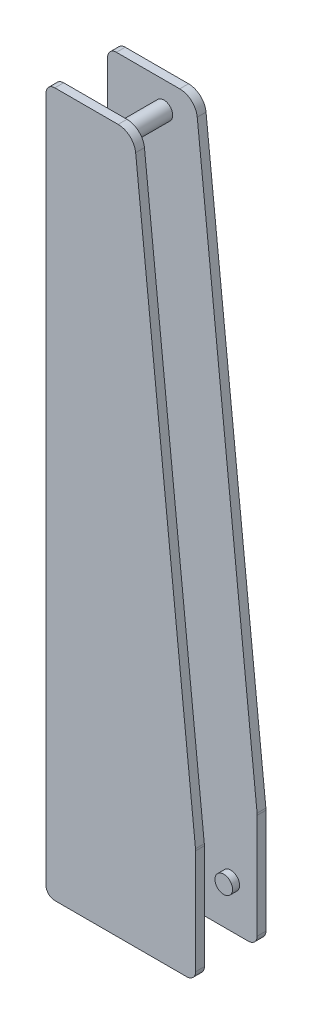
ISO-10303-21;
HEADER;
FILE_DESCRIPTION(('STEP AP214'),'2;1');
FILE_NAME('part.step','',(''),(''),'','','');
FILE_SCHEMA(('AUTOMOTIVE_DESIGN { 1 0 10303 214 1 1 1 1 }'));
ENDSEC;
DATA;
#1=APPLICATION_CONTEXT('core data for automotive mechanical design processes');
#2=APPLICATION_PROTOCOL_DEFINITION('international standard','automotive_design',2000,#1);
#3=PRODUCT_CONTEXT('',#1,'mechanical');
#4=PRODUCT('Part','Part','',(#3));
#5=PRODUCT_RELATED_PRODUCT_CATEGORY('part','',(#4));
#6=PRODUCT_DEFINITION_FORMATION('','',#4);
#7=PRODUCT_DEFINITION_CONTEXT('part definition',#1,'design');
#8=PRODUCT_DEFINITION('design','',#6,#7);
#9=PRODUCT_DEFINITION_SHAPE('','',#8);
#10=(LENGTH_UNIT() NAMED_UNIT(*) SI_UNIT(.MILLI.,.METRE.));
#11=(NAMED_UNIT(*) PLANE_ANGLE_UNIT() SI_UNIT($,.RADIAN.));
#12=(NAMED_UNIT(*) SI_UNIT($,.STERADIAN.) SOLID_ANGLE_UNIT());
#13=UNCERTAINTY_MEASURE_WITH_UNIT(LENGTH_MEASURE(1.E-05),#10,'distance_accuracy_value','');
#14=(GEOMETRIC_REPRESENTATION_CONTEXT(3) GLOBAL_UNCERTAINTY_ASSIGNED_CONTEXT((#13)) GLOBAL_UNIT_ASSIGNED_CONTEXT((#10,
#11,#12)) REPRESENTATION_CONTEXT('',''));
#15=CARTESIAN_POINT('',(0.,0.,0.));
#16=DIRECTION('',(0.,0.,1.));
#17=DIRECTION('',(1.,0.,0.));
#18=AXIS2_PLACEMENT_3D('',#15,#16,#17);
#19=CARTESIAN_POINT('',(20.,-75.,35.));
#20=DIRECTION('',(0.,0.,-1.));
#21=DIRECTION('',(-1.,0.,0.));
#22=AXIS2_PLACEMENT_3D('',#19,#20,#21);
#23=CYLINDRICAL_SURFACE('',#22,5.);
#24=CARTESIAN_POINT('',(20.,-75.,5.));
#25=DIRECTION('',(0.,0.,-1.));
#26=DIRECTION('',(-1.,0.,0.));
#27=AXIS2_PLACEMENT_3D('',#24,#25,#26);
#28=CIRCLE('',#27,5.);
#29=CARTESIAN_POINT('',(15.,-75.,5.));
#30=VERTEX_POINT('',#29);
#31=EDGE_CURVE('E11',#30,#30,#28,.F.);
#32=ORIENTED_EDGE('',*,*,#31,.T.);
#33=EDGE_LOOP('',(#32));
#34=FACE_BOUND('',#33,.T.);
#35=CARTESIAN_POINT('',(20.,-75.,9.));
#36=DIRECTION('',(0.,0.,1.));
#37=DIRECTION('',(1.,0.,0.));
#38=AXIS2_PLACEMENT_3D('',#35,#36,#37);
#39=CIRCLE('',#38,5.);
#40=CARTESIAN_POINT('',(25.,-75.,9.));
#41=VERTEX_POINT('',#40);
#42=EDGE_CURVE('E519',#41,#41,#39,.T.);
#43=ORIENTED_EDGE('',*,*,#42,.F.);
#44=EDGE_LOOP('',(#43));
#45=FACE_BOUND('',#44,.T.);
#46=ADVANCED_FACE('F45',(#34,#45),#23,.T.);
#47=CARTESIAN_POINT('',(25.,-35.5209702462818,5.));
#48=DIRECTION('',(0.,0.,-1.));
#49=DIRECTION('',(-1.,0.,0.));
#50=AXIS2_PLACEMENT_3D('',#47,#48,#49);
#51=CYLINDRICAL_SURFACE('',#50,10.);
#52=CARTESIAN_POINT('',(25.,-35.5209702462818,0.));
#53=DIRECTION('',(0.,0.,1.));
#54=DIRECTION('',(-1.,0.,0.));
#55=AXIS2_PLACEMENT_3D('',#52,#53,#54);
#56=CIRCLE('',#55,10.);
#57=CARTESIAN_POINT('',(35.,-35.5209702462818,0.));
#58=VERTEX_POINT('',#57);
#59=CARTESIAN_POINT('',(34.9458649284941,-34.481850029872,0.));
#60=VERTEX_POINT('',#59);
#61=EDGE_CURVE('E159',#58,#60,#56,.T.);
#62=ORIENTED_EDGE('',*,*,#61,.T.);
#63=DIRECTION('',(0.,0.,-1.));
#64=VECTOR('',#63,1.);
#65=CARTESIAN_POINT('',(34.9458649284941,-34.481850029872,5.));
#66=LINE('',#65,#64);
#67=CARTESIAN_POINT('',(34.9458649284941,-34.481850029872,5.));
#68=VERTEX_POINT('',#67);
#69=EDGE_CURVE('E197',#68,#60,#66,.T.);
#70=ORIENTED_EDGE('',*,*,#69,.F.);
#71=CARTESIAN_POINT('',(25.,-35.5209702462818,5.));
#72=DIRECTION('',(0.,0.,1.));
#73=DIRECTION('',(-1.,0.,0.));
#74=AXIS2_PLACEMENT_3D('',#71,#72,#73);
#75=CIRCLE('',#74,10.);
#76=CARTESIAN_POINT('',(35.,-35.5209702462818,5.));
#77=VERTEX_POINT('',#76);
#78=EDGE_CURVE('E178',#77,#68,#75,.T.);
#79=ORIENTED_EDGE('',*,*,#78,.F.);
#80=DIRECTION('',(0.,0.,-1.));
#81=VECTOR('',#80,1.);
#82=CARTESIAN_POINT('',(35.,-35.5209702462818,5.));
#83=LINE('',#82,#81);
#84=EDGE_CURVE('E155',#77,#58,#83,.T.);
#85=ORIENTED_EDGE('',*,*,#84,.T.);
#86=EDGE_LOOP('',(#62,#70,#79,#85));
#87=FACE_BOUND('',#86,.T.);
#88=ADVANCED_FACE('F47',(#87),#51,.T.);
#89=CARTESIAN_POINT('',(0.936211320673575,291.03912021641,5.));
#90=DIRECTION('',(-0.994586492849407,-0.103912021640983,0.));
#91=DIRECTION('',(0.103912021640983,-0.994586492849407,0.));
#92=AXIS2_PLACEMENT_3D('',#89,#90,#91);
#93=PLANE('',#92);
#94=DIRECTION('',(-0.103912021640983,0.994586492849407,0.));
#95=VECTOR('',#94,1.);
#96=CARTESIAN_POINT('',(0.936211320673575,291.03912021641,0.));
#97=LINE('',#96,#95);
#98=CARTESIAN_POINT('',(0.936211320673575,291.03912021641,0.));
#99=VERTEX_POINT('',#98);
#100=EDGE_CURVE('E162',#60,#99,#97,.T.);
#101=ORIENTED_EDGE('',*,*,#100,.T.);
#102=DIRECTION('',(0.,0.,-1.));
#103=VECTOR('',#102,1.);
#104=CARTESIAN_POINT('',(0.936211320673575,291.03912021641,5.));
#105=LINE('',#104,#103);
#106=CARTESIAN_POINT('',(0.936211320673575,291.03912021641,5.));
#107=VERTEX_POINT('',#106);
#108=EDGE_CURVE('E194',#107,#99,#105,.T.);
#109=ORIENTED_EDGE('',*,*,#108,.F.);
#110=DIRECTION('',(-0.103912021640983,0.994586492849407,0.));
#111=VECTOR('',#110,1.);
#112=CARTESIAN_POINT('',(0.936211320673575,291.03912021641,5.));
#113=LINE('',#112,#111);
#114=EDGE_CURVE('E113',#68,#107,#113,.T.);
#115=ORIENTED_EDGE('',*,*,#114,.F.);
#116=ORIENTED_EDGE('',*,*,#69,.T.);
#117=EDGE_LOOP('',(#101,#109,#115,#116));
#118=FACE_BOUND('',#117,.T.);
#119=ADVANCED_FACE('F227',(#118),#93,.F.);
#120=CARTESIAN_POINT('',(-9.0096536078205,290.,5.));
#121=DIRECTION('',(0.,0.,-1.));
#122=DIRECTION('',(-1.,0.,0.));
#123=AXIS2_PLACEMENT_3D('',#120,#121,#122);
#124=CYLINDRICAL_SURFACE('',#123,10.);
#125=CARTESIAN_POINT('',(-9.0096536078205,290.,0.));
#126=DIRECTION('',(0.,0.,1.));
#127=DIRECTION('',(1.,0.,0.));
#128=AXIS2_PLACEMENT_3D('',#125,#126,#127);
#129=CIRCLE('',#128,10.);
#130=CARTESIAN_POINT('',(-9.0096536078205,300.,0.));
#131=VERTEX_POINT('',#130);
#132=EDGE_CURVE('E165',#99,#131,#129,.T.);
#133=ORIENTED_EDGE('',*,*,#132,.T.);
#134=DIRECTION('',(0.,0.,-1.));
#135=VECTOR('',#134,1.);
#136=CARTESIAN_POINT('',(-9.0096536078205,300.,5.));
#137=LINE('',#136,#135);
#138=CARTESIAN_POINT('',(-9.0096536078205,300.,5.));
#139=VERTEX_POINT('',#138);
#140=EDGE_CURVE('E191',#139,#131,#137,.T.);
#141=ORIENTED_EDGE('',*,*,#140,.F.);
#142=CARTESIAN_POINT('',(-9.0096536078205,290.,5.));
#143=DIRECTION('',(0.,0.,1.));
#144=DIRECTION('',(1.,0.,0.));
#145=AXIS2_PLACEMENT_3D('',#142,#143,#144);
#146=CIRCLE('',#145,10.);
#147=EDGE_CURVE('E259',#107,#139,#146,.T.);
#148=ORIENTED_EDGE('',*,*,#147,.F.);
#149=ORIENTED_EDGE('',*,*,#108,.T.);
#150=EDGE_LOOP('',(#133,#141,#148,#149));
#151=FACE_BOUND('',#150,.T.);
#152=ADVANCED_FACE('F283',(#151),#124,.T.);
#153=CARTESIAN_POINT('',(-45.,300.,5.));
#154=DIRECTION('',(0.,-1.,0.));
#155=DIRECTION('',(0.,0.,-1.));
#156=AXIS2_PLACEMENT_3D('',#153,#154,#155);
#157=PLANE('',#156);
#158=DIRECTION('',(-1.,0.,0.));
#159=VECTOR('',#158,1.);
#160=CARTESIAN_POINT('',(-45.,300.,0.));
#161=LINE('',#160,#159);
#162=CARTESIAN_POINT('',(-45.,300.,0.));
#163=VERTEX_POINT('',#162);
#164=EDGE_CURVE('E167',#131,#163,#161,.T.);
#165=ORIENTED_EDGE('',*,*,#164,.T.);
#166=DIRECTION('',(0.,0.,-1.));
#167=VECTOR('',#166,1.);
#168=CARTESIAN_POINT('',(-45.,300.,5.));
#169=LINE('',#168,#167);
#170=CARTESIAN_POINT('',(-45.,300.,5.));
#171=VERTEX_POINT('',#170);
#172=EDGE_CURVE('E188',#171,#163,#169,.T.);
#173=ORIENTED_EDGE('',*,*,#172,.F.);
#174=DIRECTION('',(-1.,0.,0.));
#175=VECTOR('',#174,1.);
#176=CARTESIAN_POINT('',(-45.,300.,5.));
#177=LINE('',#176,#175);
#178=EDGE_CURVE('E261',#139,#171,#177,.T.);
#179=ORIENTED_EDGE('',*,*,#178,.F.);
#180=ORIENTED_EDGE('',*,*,#140,.T.);
#181=EDGE_LOOP('',(#165,#173,#179,#180));
#182=FACE_BOUND('',#181,.T.);
#183=ADVANCED_FACE('F288',(#182),#157,.F.);
#184=CARTESIAN_POINT('',(-45.,295.,5.));
#185=DIRECTION('',(0.,0.,-1.));
#186=DIRECTION('',(-1.,0.,0.));
#187=AXIS2_PLACEMENT_3D('',#184,#185,#186);
#188=CYLINDRICAL_SURFACE('',#187,5.00000000000001);
#189=CARTESIAN_POINT('',(-45.,295.,0.));
#190=DIRECTION('',(0.,0.,1.));
#191=DIRECTION('',(1.,0.,0.));
#192=AXIS2_PLACEMENT_3D('',#189,#190,#191);
#193=CIRCLE('',#192,5.00000000000001);
#194=CARTESIAN_POINT('',(-50.,295.,0.));
#195=VERTEX_POINT('',#194);
#196=EDGE_CURVE('E169',#163,#195,#193,.T.);
#197=ORIENTED_EDGE('',*,*,#196,.T.);
#198=DIRECTION('',(0.,0.,-1.));
#199=VECTOR('',#198,1.);
#200=CARTESIAN_POINT('',(-50.,295.,5.));
#201=LINE('',#200,#199);
#202=CARTESIAN_POINT('',(-50.,295.,5.));
#203=VERTEX_POINT('',#202);
#204=EDGE_CURVE('E185',#203,#195,#201,.T.);
#205=ORIENTED_EDGE('',*,*,#204,.F.);
#206=CARTESIAN_POINT('',(-45.,295.,5.));
#207=DIRECTION('',(0.,0.,1.));
#208=DIRECTION('',(1.,0.,0.));
#209=AXIS2_PLACEMENT_3D('',#206,#207,#208);
#210=CIRCLE('',#209,5.00000000000001);
#211=EDGE_CURVE('E263',#171,#203,#210,.T.);
#212=ORIENTED_EDGE('',*,*,#211,.F.);
#213=ORIENTED_EDGE('',*,*,#172,.T.);
#214=EDGE_LOOP('',(#197,#205,#212,#213));
#215=FACE_BOUND('',#214,.T.);
#216=ADVANCED_FACE('F291',(#215),#188,.T.);
#217=CARTESIAN_POINT('',(-50.,295.,5.));
#218=DIRECTION('',(1.,0.,0.));
#219=DIRECTION('',(0.,1.,0.));
#220=AXIS2_PLACEMENT_3D('',#217,#218,#219);
#221=PLANE('',#220);
#222=DIRECTION('',(0.,-1.,0.));
#223=VECTOR('',#222,1.);
#224=CARTESIAN_POINT('',(-50.,295.,0.));
#225=LINE('',#224,#223);
#226=CARTESIAN_POINT('',(-50.,-95.,0.));
#227=VERTEX_POINT('',#226);
#228=EDGE_CURVE('E171',#195,#227,#225,.T.);
#229=ORIENTED_EDGE('',*,*,#228,.T.);
#230=DIRECTION('',(0.,0.,-1.));
#231=VECTOR('',#230,1.);
#232=CARTESIAN_POINT('',(-50.,-95.,5.));
#233=LINE('',#232,#231);
#234=CARTESIAN_POINT('',(-50.,-95.,5.));
#235=VERTEX_POINT('',#234);
#236=EDGE_CURVE('E182',#235,#227,#233,.T.);
#237=ORIENTED_EDGE('',*,*,#236,.F.);
#238=DIRECTION('',(0.,-1.,0.));
#239=VECTOR('',#238,1.);
#240=CARTESIAN_POINT('',(-50.,295.,5.));
#241=LINE('',#240,#239);
#242=EDGE_CURVE('E265',#203,#235,#241,.T.);
#243=ORIENTED_EDGE('',*,*,#242,.F.);
#244=ORIENTED_EDGE('',*,*,#204,.T.);
#245=EDGE_LOOP('',(#229,#237,#243,#244));
#246=FACE_BOUND('',#245,.T.);
#247=ADVANCED_FACE('F271',(#246),#221,.F.);
#248=CARTESIAN_POINT('',(-45.,-95.,5.));
#249=DIRECTION('',(0.,0.,-1.));
#250=DIRECTION('',(-1.,0.,0.));
#251=AXIS2_PLACEMENT_3D('',#248,#249,#250);
#252=CYLINDRICAL_SURFACE('',#251,5.);
#253=CARTESIAN_POINT('',(-45.,-95.,0.));
#254=DIRECTION('',(0.,0.,1.));
#255=DIRECTION('',(1.,0.,0.));
#256=AXIS2_PLACEMENT_3D('',#253,#254,#255);
#257=CIRCLE('',#256,5.);
#258=CARTESIAN_POINT('',(-45.,-100.,0.));
#259=VERTEX_POINT('',#258);
#260=EDGE_CURVE('E173',#227,#259,#257,.T.);
#261=ORIENTED_EDGE('',*,*,#260,.T.);
#262=DIRECTION('',(0.,0.,-1.));
#263=VECTOR('',#262,1.);
#264=CARTESIAN_POINT('',(-45.,-100.,5.));
#265=LINE('',#264,#263);
#266=CARTESIAN_POINT('',(-45.,-100.,5.));
#267=VERTEX_POINT('',#266);
#268=EDGE_CURVE('E150',#267,#259,#265,.T.);
#269=ORIENTED_EDGE('',*,*,#268,.F.);
#270=CARTESIAN_POINT('',(-45.,-95.,5.));
#271=DIRECTION('',(0.,0.,1.));
#272=DIRECTION('',(1.,0.,0.));
#273=AXIS2_PLACEMENT_3D('',#270,#271,#272);
#274=CIRCLE('',#273,5.);
#275=EDGE_CURVE('E141',#235,#267,#274,.T.);
#276=ORIENTED_EDGE('',*,*,#275,.F.);
#277=ORIENTED_EDGE('',*,*,#236,.T.);
#278=EDGE_LOOP('',(#261,#269,#276,#277));
#279=FACE_BOUND('',#278,.T.);
#280=ADVANCED_FACE('F275',(#279),#252,.T.);
#281=CARTESIAN_POINT('',(-45.,-100.,5.));
#282=DIRECTION('',(0.,1.,0.));
#283=DIRECTION('',(-1.,0.,0.));
#284=AXIS2_PLACEMENT_3D('',#281,#282,#283);
#285=PLANE('',#284);
#286=DIRECTION('',(1.,0.,0.));
#287=VECTOR('',#286,1.);
#288=CARTESIAN_POINT('',(-45.,-100.,0.));
#289=LINE('',#288,#287);
#290=CARTESIAN_POINT('',(30.,-100.,0.));
#291=VERTEX_POINT('',#290);
#292=EDGE_CURVE('E149',#259,#291,#289,.T.);
#293=ORIENTED_EDGE('',*,*,#292,.T.);
#294=DIRECTION('',(0.,0.,-1.));
#295=VECTOR('',#294,1.);
#296=CARTESIAN_POINT('',(30.,-100.,5.));
#297=LINE('',#296,#295);
#298=CARTESIAN_POINT('',(30.,-100.,5.));
#299=VERTEX_POINT('',#298);
#300=EDGE_CURVE('E146',#299,#291,#297,.T.);
#301=ORIENTED_EDGE('',*,*,#300,.F.);
#302=DIRECTION('',(1.,0.,0.));
#303=VECTOR('',#302,1.);
#304=CARTESIAN_POINT('',(-45.,-100.,5.));
#305=LINE('',#304,#303);
#306=EDGE_CURVE('E135',#267,#299,#305,.T.);
#307=ORIENTED_EDGE('',*,*,#306,.F.);
#308=ORIENTED_EDGE('',*,*,#268,.T.);
#309=EDGE_LOOP('',(#293,#301,#307,#308));
#310=FACE_BOUND('',#309,.T.);
#311=ADVANCED_FACE('F147',(#310),#285,.F.);
#312=CARTESIAN_POINT('',(30.,-95.,5.));
#313=DIRECTION('',(0.,0.,-1.));
#314=DIRECTION('',(-1.,0.,0.));
#315=AXIS2_PLACEMENT_3D('',#312,#313,#314);
#316=CYLINDRICAL_SURFACE('',#315,5.00000000000001);
#317=CARTESIAN_POINT('',(30.,-95.,0.));
#318=DIRECTION('',(0.,0.,1.));
#319=DIRECTION('',(1.,0.,0.));
#320=AXIS2_PLACEMENT_3D('',#317,#318,#319);
#321=CIRCLE('',#320,5.00000000000001);
#322=CARTESIAN_POINT('',(35.,-95.,0.));
#323=VERTEX_POINT('',#322);
#324=EDGE_CURVE('E98',#291,#323,#321,.T.);
#325=ORIENTED_EDGE('',*,*,#324,.T.);
#326=DIRECTION('',(0.,0.,-1.));
#327=VECTOR('',#326,1.);
#328=CARTESIAN_POINT('',(35.,-95.,5.));
#329=LINE('',#328,#327);
#330=CARTESIAN_POINT('',(35.,-95.,5.));
#331=VERTEX_POINT('',#330);
#332=EDGE_CURVE('E151',#331,#323,#329,.T.);
#333=ORIENTED_EDGE('',*,*,#332,.F.);
#334=CARTESIAN_POINT('',(30.,-95.,5.));
#335=DIRECTION('',(0.,0.,1.));
#336=DIRECTION('',(1.,0.,0.));
#337=AXIS2_PLACEMENT_3D('',#334,#335,#336);
#338=CIRCLE('',#337,5.00000000000001);
#339=EDGE_CURVE('E139',#299,#331,#338,.T.);
#340=ORIENTED_EDGE('',*,*,#339,.F.);
#341=ORIENTED_EDGE('',*,*,#300,.T.);
#342=EDGE_LOOP('',(#325,#333,#340,#341));
#343=FACE_BOUND('',#342,.T.);
#344=ADVANCED_FACE('F153',(#343),#316,.T.);
#345=CARTESIAN_POINT('',(35.,-35.5209702462818,5.));
#346=DIRECTION('',(-1.,0.,0.));
#347=DIRECTION('',(0.,-1.,0.));
#348=AXIS2_PLACEMENT_3D('',#345,#346,#347);
#349=PLANE('',#348);
#350=DIRECTION('',(0.,1.,0.));
#351=VECTOR('',#350,1.);
#352=CARTESIAN_POINT('',(35.,-35.5209702462818,0.));
#353=LINE('',#352,#351);
#354=EDGE_CURVE('E104',#323,#58,#353,.T.);
#355=ORIENTED_EDGE('',*,*,#354,.T.);
#356=ORIENTED_EDGE('',*,*,#84,.F.);
#357=DIRECTION('',(0.,1.,0.));
#358=VECTOR('',#357,1.);
#359=CARTESIAN_POINT('',(35.,-35.5209702462818,5.));
#360=LINE('',#359,#358);
#361=EDGE_CURVE('E62',#331,#77,#360,.T.);
#362=ORIENTED_EDGE('',*,*,#361,.F.);
#363=ORIENTED_EDGE('',*,*,#332,.T.);
#364=EDGE_LOOP('',(#355,#356,#362,#363));
#365=FACE_BOUND('',#364,.T.);
#366=ADVANCED_FACE('F205',(#365),#349,.F.);
#367=CARTESIAN_POINT('',(25.,-35.5209702462818,5.));
#368=DIRECTION('',(0.,0.,-1.));
#369=DIRECTION('',(-1.,0.,0.));
#370=AXIS2_PLACEMENT_3D('',#367,#368,#369);
#371=PLANE('',#370);
#372=ORIENTED_EDGE('',*,*,#31,.F.);
#373=EDGE_LOOP('',(#372));
#374=FACE_BOUND('',#373,.T.);
#375=CARTESIAN_POINT('',(-18.,285.,5.));
#376=DIRECTION('',(0.,0.,-1.));
#377=DIRECTION('',(-1.,0.,0.));
#378=AXIS2_PLACEMENT_3D('',#375,#376,#377);
#379=CIRCLE('',#378,5.);
#380=CARTESIAN_POINT('',(-23.,285.,5.));
#381=VERTEX_POINT('',#380);
#382=EDGE_CURVE('E54',#381,#381,#379,.F.);
#383=ORIENTED_EDGE('',*,*,#382,.F.);
#384=EDGE_LOOP('',(#383));
#385=FACE_BOUND('',#384,.T.);
#386=ORIENTED_EDGE('',*,*,#78,.T.);
#387=ORIENTED_EDGE('',*,*,#114,.T.);
#388=ORIENTED_EDGE('',*,*,#147,.T.);
#389=ORIENTED_EDGE('',*,*,#178,.T.);
#390=ORIENTED_EDGE('',*,*,#211,.T.);
#391=ORIENTED_EDGE('',*,*,#242,.T.);
#392=ORIENTED_EDGE('',*,*,#275,.T.);
#393=ORIENTED_EDGE('',*,*,#306,.T.);
#394=ORIENTED_EDGE('',*,*,#339,.T.);
#395=ORIENTED_EDGE('',*,*,#361,.T.);
#396=EDGE_LOOP('',(#386,#387,#388,#389,#390,#391,#392,#393,#394,#395));
#397=FACE_BOUND('',#396,.T.);
#398=ADVANCED_FACE('F137',(#374,#385,#397),#371,.F.);
#399=CARTESIAN_POINT('',(25.,-35.5209702462818,0.));
#400=DIRECTION('',(0.,0.,-1.));
#401=DIRECTION('',(-1.,0.,0.));
#402=AXIS2_PLACEMENT_3D('',#399,#400,#401);
#403=PLANE('',#402);
#404=ORIENTED_EDGE('',*,*,#61,.F.);
#405=ORIENTED_EDGE('',*,*,#354,.F.);
#406=ORIENTED_EDGE('',*,*,#324,.F.);
#407=ORIENTED_EDGE('',*,*,#292,.F.);
#408=ORIENTED_EDGE('',*,*,#260,.F.);
#409=ORIENTED_EDGE('',*,*,#228,.F.);
#410=ORIENTED_EDGE('',*,*,#196,.F.);
#411=ORIENTED_EDGE('',*,*,#164,.F.);
#412=ORIENTED_EDGE('',*,*,#132,.F.);
#413=ORIENTED_EDGE('',*,*,#100,.F.);
#414=EDGE_LOOP('',(#404,#405,#406,#407,#408,#409,#410,#411,#412,#413));
#415=FACE_BOUND('',#414,.T.);
#416=ADVANCED_FACE('F204',(#415),#403,.T.);
#417=CARTESIAN_POINT('',(-18.,285.,35.));
#418=DIRECTION('',(0.,0.,-1.));
#419=DIRECTION('',(-1.,0.,0.));
#420=AXIS2_PLACEMENT_3D('',#417,#418,#419);
#421=CYLINDRICAL_SURFACE('',#420,5.);
#422=CARTESIAN_POINT('',(-18.,285.,35.));
#423=DIRECTION('',(0.,0.,1.));
#424=DIRECTION('',(1.,0.,0.));
#425=AXIS2_PLACEMENT_3D('',#422,#423,#424);
#426=CIRCLE('',#425,5.);
#427=CARTESIAN_POINT('',(-13.,285.,35.));
#428=VERTEX_POINT('',#427);
#429=EDGE_CURVE('E163',#428,#428,#426,.T.);
#430=ORIENTED_EDGE('',*,*,#429,.F.);
#431=EDGE_LOOP('',(#430));
#432=FACE_BOUND('',#431,.T.);
#433=ORIENTED_EDGE('',*,*,#382,.T.);
#434=EDGE_LOOP('',(#433));
#435=FACE_BOUND('',#434,.T.);
#436=ADVANCED_FACE('F201',(#432,#435),#421,.T.);
#437=CARTESIAN_POINT('',(20.,-75.,31.));
#438=DIRECTION('',(0.,0.,1.));
#439=DIRECTION('',(1.,0.,0.));
#440=AXIS2_PLACEMENT_3D('',#437,#438,#439);
#441=CIRCLE('',#440,5.);
#442=CARTESIAN_POINT('',(25.,-75.,31.));
#443=VERTEX_POINT('',#442);
#444=EDGE_CURVE('E243',#443,#443,#441,.T.);
#445=ORIENTED_EDGE('',*,*,#444,.T.);
#446=EDGE_LOOP('',(#445));
#447=FACE_BOUND('',#446,.T.);
#448=CARTESIAN_POINT('',(20.,-75.,35.));
#449=DIRECTION('',(0.,0.,1.));
#450=DIRECTION('',(1.,0.,0.));
#451=AXIS2_PLACEMENT_3D('',#448,#449,#450);
#452=CIRCLE('',#451,5.);
#453=CARTESIAN_POINT('',(25.,-75.,35.));
#454=VERTEX_POINT('',#453);
#455=EDGE_CURVE('E246',#454,#454,#452,.T.);
#456=ORIENTED_EDGE('',*,*,#455,.F.);
#457=EDGE_LOOP('',(#456));
#458=FACE_BOUND('',#457,.T.);
#459=ADVANCED_FACE('F221',(#447,#458),#23,.T.);
#460=CARTESIAN_POINT('',(30.,-95.,40.));
#461=DIRECTION('',(0.,0.,-1.));
#462=DIRECTION('',(-1.,0.,0.));
#463=AXIS2_PLACEMENT_3D('',#460,#461,#462);
#464=CYLINDRICAL_SURFACE('',#463,5.);
#465=CARTESIAN_POINT('',(30.,-95.,35.));
#466=DIRECTION('',(0.,0.,1.));
#467=DIRECTION('',(1.,0.,0.));
#468=AXIS2_PLACEMENT_3D('',#465,#466,#467);
#469=CIRCLE('',#468,5.);
#470=CARTESIAN_POINT('',(30.,-100.,35.));
#471=VERTEX_POINT('',#470);
#472=CARTESIAN_POINT('',(35.,-95.,35.));
#473=VERTEX_POINT('',#472);
#474=EDGE_CURVE('E518',#471,#473,#469,.T.);
#475=ORIENTED_EDGE('',*,*,#474,.T.);
#476=DIRECTION('',(0.,0.,-1.));
#477=VECTOR('',#476,1.);
#478=CARTESIAN_POINT('',(35.,-95.,40.));
#479=LINE('',#478,#477);
#480=CARTESIAN_POINT('',(35.,-95.,40.));
#481=VERTEX_POINT('',#480);
#482=EDGE_CURVE('E248',#481,#473,#479,.T.);
#483=ORIENTED_EDGE('',*,*,#482,.F.);
#484=CARTESIAN_POINT('',(30.,-95.,40.));
#485=DIRECTION('',(0.,0.,1.));
#486=DIRECTION('',(1.,0.,0.));
#487=AXIS2_PLACEMENT_3D('',#484,#485,#486);
#488=CIRCLE('',#487,5.);
#489=CARTESIAN_POINT('',(30.,-100.,40.));
#490=VERTEX_POINT('',#489);
#491=EDGE_CURVE('E527',#490,#481,#488,.T.);
#492=ORIENTED_EDGE('',*,*,#491,.F.);
#493=DIRECTION('',(0.,0.,-1.));
#494=VECTOR('',#493,1.);
#495=CARTESIAN_POINT('',(30.,-100.,40.));
#496=LINE('',#495,#494);
#497=EDGE_CURVE('E557',#490,#471,#496,.T.);
#498=ORIENTED_EDGE('',*,*,#497,.T.);
#499=EDGE_LOOP('',(#475,#483,#492,#498));
#500=FACE_BOUND('',#499,.T.);
#501=ADVANCED_FACE('F231',(#500),#464,.T.);
#502=CARTESIAN_POINT('',(35.,-95.,40.));
#503=DIRECTION('',(-1.,0.,0.));
#504=DIRECTION('',(0.,0.,1.));
#505=AXIS2_PLACEMENT_3D('',#502,#503,#504);
#506=PLANE('',#505);
#507=DIRECTION('',(0.,1.,0.));
#508=VECTOR('',#507,1.);
#509=CARTESIAN_POINT('',(35.,-95.,35.));
#510=LINE('',#509,#508);
#511=CARTESIAN_POINT('',(35.,-35.5209702462818,35.));
#512=VERTEX_POINT('',#511);
#513=EDGE_CURVE('E522',#473,#512,#510,.T.);
#514=ORIENTED_EDGE('',*,*,#513,.T.);
#515=DIRECTION('',(0.,0.,-1.));
#516=VECTOR('',#515,1.);
#517=CARTESIAN_POINT('',(35.,-35.5209702462818,40.));
#518=LINE('',#517,#516);
#519=CARTESIAN_POINT('',(35.,-35.5209702462818,40.));
#520=VERTEX_POINT('',#519);
#521=EDGE_CURVE('E253',#520,#512,#518,.T.);
#522=ORIENTED_EDGE('',*,*,#521,.F.);
#523=DIRECTION('',(0.,1.,0.));
#524=VECTOR('',#523,1.);
#525=CARTESIAN_POINT('',(35.,-95.,40.));
#526=LINE('',#525,#524);
#527=EDGE_CURVE('E530',#481,#520,#526,.T.);
#528=ORIENTED_EDGE('',*,*,#527,.F.);
#529=ORIENTED_EDGE('',*,*,#482,.T.);
#530=EDGE_LOOP('',(#514,#522,#528,#529));
#531=FACE_BOUND('',#530,.T.);
#532=ADVANCED_FACE('F237',(#531),#506,.F.);
#533=CARTESIAN_POINT('',(25.,-35.5209702462818,40.));
#534=DIRECTION('',(0.,0.,-1.));
#535=DIRECTION('',(-1.,0.,0.));
#536=AXIS2_PLACEMENT_3D('',#533,#534,#535);
#537=CYLINDRICAL_SURFACE('',#536,10.);
#538=CARTESIAN_POINT('',(25.,-35.5209702462818,35.));
#539=DIRECTION('',(0.,0.,1.));
#540=DIRECTION('',(1.,0.,0.));
#541=AXIS2_PLACEMENT_3D('',#538,#539,#540);
#542=CIRCLE('',#541,10.);
#543=CARTESIAN_POINT('',(34.9458649284941,-34.481850029872,35.));
#544=VERTEX_POINT('',#543);
#545=EDGE_CURVE('E561',#512,#544,#542,.T.);
#546=ORIENTED_EDGE('',*,*,#545,.T.);
#547=DIRECTION('',(0.,0.,-1.));
#548=VECTOR('',#547,1.);
#549=CARTESIAN_POINT('',(34.9458649284941,-34.481850029872,40.));
#550=LINE('',#549,#548);
#551=CARTESIAN_POINT('',(34.9458649284941,-34.481850029872,40.));
#552=VERTEX_POINT('',#551);
#553=EDGE_CURVE('E604',#552,#544,#550,.T.);
#554=ORIENTED_EDGE('',*,*,#553,.F.);
#555=CARTESIAN_POINT('',(25.,-35.5209702462818,40.));
#556=DIRECTION('',(0.,0.,1.));
#557=DIRECTION('',(1.,0.,0.));
#558=AXIS2_PLACEMENT_3D('',#555,#556,#557);
#559=CIRCLE('',#558,10.);
#560=EDGE_CURVE('E534',#520,#552,#559,.T.);
#561=ORIENTED_EDGE('',*,*,#560,.F.);
#562=ORIENTED_EDGE('',*,*,#521,.T.);
#563=EDGE_LOOP('',(#546,#554,#561,#562));
#564=FACE_BOUND('',#563,.T.);
#565=ADVANCED_FACE('F393',(#564),#537,.T.);
#566=CARTESIAN_POINT('',(34.9458649284941,-34.481850029872,40.));
#567=DIRECTION('',(-0.994586492849407,-0.103912021640983,0.));
#568=DIRECTION('',(0.103912021640983,-0.994586492849407,0.));
#569=AXIS2_PLACEMENT_3D('',#566,#567,#568);
#570=PLANE('',#569);
#571=DIRECTION('',(-0.103912021640983,0.994586492849407,0.));
#572=VECTOR('',#571,1.);
#573=CARTESIAN_POINT('',(34.9458649284941,-34.481850029872,35.));
#574=LINE('',#573,#572);
#575=CARTESIAN_POINT('',(0.936211320673582,291.03912021641,35.));
#576=VERTEX_POINT('',#575);
#577=EDGE_CURVE('E564',#544,#576,#574,.T.);
#578=ORIENTED_EDGE('',*,*,#577,.T.);
#579=DIRECTION('',(0.,0.,-1.));
#580=VECTOR('',#579,1.);
#581=CARTESIAN_POINT('',(0.936211320673582,291.03912021641,40.));
#582=LINE('',#581,#580);
#583=CARTESIAN_POINT('',(0.936211320673582,291.03912021641,40.));
#584=VERTEX_POINT('',#583);
#585=EDGE_CURVE('E601',#584,#576,#582,.T.);
#586=ORIENTED_EDGE('',*,*,#585,.F.);
#587=DIRECTION('',(-0.103912021640983,0.994586492849407,0.));
#588=VECTOR('',#587,1.);
#589=CARTESIAN_POINT('',(34.9458649284941,-34.481850029872,40.));
#590=LINE('',#589,#588);
#591=EDGE_CURVE('E537',#552,#584,#590,.T.);
#592=ORIENTED_EDGE('',*,*,#591,.F.);
#593=ORIENTED_EDGE('',*,*,#553,.T.);
#594=EDGE_LOOP('',(#578,#586,#592,#593));
#595=FACE_BOUND('',#594,.T.);
#596=ADVANCED_FACE('F403',(#595),#570,.F.);
#597=CARTESIAN_POINT('',(-9.0096536078205,290.,40.));
#598=DIRECTION('',(0.,0.,-1.));
#599=DIRECTION('',(-1.,0.,0.));
#600=AXIS2_PLACEMENT_3D('',#597,#598,#599);
#601=CYLINDRICAL_SURFACE('',#600,10.);
#602=CARTESIAN_POINT('',(-9.0096536078205,290.,35.));
#603=DIRECTION('',(0.,0.,1.));
#604=DIRECTION('',(1.,0.,0.));
#605=AXIS2_PLACEMENT_3D('',#602,#603,#604);
#606=CIRCLE('',#605,10.);
#607=CARTESIAN_POINT('',(-9.0096536078205,300.,35.));
#608=VERTEX_POINT('',#607);
#609=EDGE_CURVE('E567',#576,#608,#606,.T.);
#610=ORIENTED_EDGE('',*,*,#609,.T.);
#611=DIRECTION('',(0.,0.,-1.));
#612=VECTOR('',#611,1.);
#613=CARTESIAN_POINT('',(-9.0096536078205,300.,40.));
#614=LINE('',#613,#612);
#615=CARTESIAN_POINT('',(-9.0096536078205,300.,40.));
#616=VERTEX_POINT('',#615);
#617=EDGE_CURVE('E598',#616,#608,#614,.T.);
#618=ORIENTED_EDGE('',*,*,#617,.F.);
#619=CARTESIAN_POINT('',(-9.0096536078205,290.,40.));
#620=DIRECTION('',(0.,0.,1.));
#621=DIRECTION('',(1.,0.,0.));
#622=AXIS2_PLACEMENT_3D('',#619,#620,#621);
#623=CIRCLE('',#622,10.);
#624=EDGE_CURVE('E540',#584,#616,#623,.T.);
#625=ORIENTED_EDGE('',*,*,#624,.F.);
#626=ORIENTED_EDGE('',*,*,#585,.T.);
#627=EDGE_LOOP('',(#610,#618,#625,#626));
#628=FACE_BOUND('',#627,.T.);
#629=ADVANCED_FACE('F413',(#628),#601,.T.);
#630=CARTESIAN_POINT('',(-9.0096536078205,300.,40.));
#631=DIRECTION('',(0.,-1.,0.));
#632=DIRECTION('',(0.,0.,-1.));
#633=AXIS2_PLACEMENT_3D('',#630,#631,#632);
#634=PLANE('',#633);
#635=DIRECTION('',(-1.,0.,0.));
#636=VECTOR('',#635,1.);
#637=CARTESIAN_POINT('',(-9.0096536078205,300.,35.));
#638=LINE('',#637,#636);
#639=CARTESIAN_POINT('',(-45.,300.,35.));
#640=VERTEX_POINT('',#639);
#641=EDGE_CURVE('E570',#608,#640,#638,.T.);
#642=ORIENTED_EDGE('',*,*,#641,.T.);
#643=DIRECTION('',(0.,0.,-1.));
#644=VECTOR('',#643,1.);
#645=CARTESIAN_POINT('',(-45.,300.,40.));
#646=LINE('',#645,#644);
#647=CARTESIAN_POINT('',(-45.,300.,40.));
#648=VERTEX_POINT('',#647);
#649=EDGE_CURVE('E595',#648,#640,#646,.T.);
#650=ORIENTED_EDGE('',*,*,#649,.F.);
#651=DIRECTION('',(-1.,0.,0.));
#652=VECTOR('',#651,1.);
#653=CARTESIAN_POINT('',(-9.0096536078205,300.,40.));
#654=LINE('',#653,#652);
#655=EDGE_CURVE('E543',#616,#648,#654,.T.);
#656=ORIENTED_EDGE('',*,*,#655,.F.);
#657=ORIENTED_EDGE('',*,*,#617,.T.);
#658=EDGE_LOOP('',(#642,#650,#656,#657));
#659=FACE_BOUND('',#658,.T.);
#660=ADVANCED_FACE('F423',(#659),#634,.F.);
#661=CARTESIAN_POINT('',(-45.,295.,40.));
#662=DIRECTION('',(0.,0.,-1.));
#663=DIRECTION('',(-1.,0.,0.));
#664=AXIS2_PLACEMENT_3D('',#661,#662,#663);
#665=CYLINDRICAL_SURFACE('',#664,5.00000000000001);
#666=CARTESIAN_POINT('',(-45.,295.,35.));
#667=DIRECTION('',(0.,0.,1.));
#668=DIRECTION('',(1.,0.,0.));
#669=AXIS2_PLACEMENT_3D('',#666,#667,#668);
#670=CIRCLE('',#669,5.00000000000001);
#671=CARTESIAN_POINT('',(-50.,295.,35.));
#672=VERTEX_POINT('',#671);
#673=EDGE_CURVE('E573',#640,#672,#670,.T.);
#674=ORIENTED_EDGE('',*,*,#673,.T.);
#675=DIRECTION('',(0.,0.,-1.));
#676=VECTOR('',#675,1.);
#677=CARTESIAN_POINT('',(-50.,295.,40.));
#678=LINE('',#677,#676);
#679=CARTESIAN_POINT('',(-50.,295.,40.));
#680=VERTEX_POINT('',#679);
#681=EDGE_CURVE('E592',#680,#672,#678,.T.);
#682=ORIENTED_EDGE('',*,*,#681,.F.);
#683=CARTESIAN_POINT('',(-45.,295.,40.));
#684=DIRECTION('',(0.,0.,1.));
#685=DIRECTION('',(1.,0.,0.));
#686=AXIS2_PLACEMENT_3D('',#683,#684,#685);
#687=CIRCLE('',#686,5.00000000000001);
#688=EDGE_CURVE('E546',#648,#680,#687,.T.);
#689=ORIENTED_EDGE('',*,*,#688,.F.);
#690=ORIENTED_EDGE('',*,*,#649,.T.);
#691=EDGE_LOOP('',(#674,#682,#689,#690));
#692=FACE_BOUND('',#691,.T.);
#693=ADVANCED_FACE('F433',(#692),#665,.T.);
#694=CARTESIAN_POINT('',(-50.,295.,40.));
#695=DIRECTION('',(1.,0.,0.));
#696=DIRECTION('',(0.,1.,0.));
#697=AXIS2_PLACEMENT_3D('',#694,#695,#696);
#698=PLANE('',#697);
#699=DIRECTION('',(0.,-1.,0.));
#700=VECTOR('',#699,1.);
#701=CARTESIAN_POINT('',(-50.,295.,35.));
#702=LINE('',#701,#700);
#703=CARTESIAN_POINT('',(-50.,-95.,35.));
#704=VERTEX_POINT('',#703);
#705=EDGE_CURVE('E576',#672,#704,#702,.T.);
#706=ORIENTED_EDGE('',*,*,#705,.T.);
#707=DIRECTION('',(0.,0.,-1.));
#708=VECTOR('',#707,1.);
#709=CARTESIAN_POINT('',(-50.,-95.,40.));
#710=LINE('',#709,#708);
#711=CARTESIAN_POINT('',(-50.,-95.,40.));
#712=VERTEX_POINT('',#711);
#713=EDGE_CURVE('E589',#712,#704,#710,.T.);
#714=ORIENTED_EDGE('',*,*,#713,.F.);
#715=DIRECTION('',(0.,-1.,0.));
#716=VECTOR('',#715,1.);
#717=CARTESIAN_POINT('',(-50.,295.,40.));
#718=LINE('',#717,#716);
#719=EDGE_CURVE('E549',#680,#712,#718,.T.);
#720=ORIENTED_EDGE('',*,*,#719,.F.);
#721=ORIENTED_EDGE('',*,*,#681,.T.);
#722=EDGE_LOOP('',(#706,#714,#720,#721));
#723=FACE_BOUND('',#722,.T.);
#724=ADVANCED_FACE('F443',(#723),#698,.F.);
#725=CARTESIAN_POINT('',(-45.,-95.,40.));
#726=DIRECTION('',(0.,0.,-1.));
#727=DIRECTION('',(-1.,0.,0.));
#728=AXIS2_PLACEMENT_3D('',#725,#726,#727);
#729=CYLINDRICAL_SURFACE('',#728,5.);
#730=CARTESIAN_POINT('',(-45.,-95.,35.));
#731=DIRECTION('',(0.,0.,1.));
#732=DIRECTION('',(1.,0.,0.));
#733=AXIS2_PLACEMENT_3D('',#730,#731,#732);
#734=CIRCLE('',#733,5.);
#735=CARTESIAN_POINT('',(-45.,-100.,35.));
#736=VERTEX_POINT('',#735);
#737=EDGE_CURVE('E579',#704,#736,#734,.T.);
#738=ORIENTED_EDGE('',*,*,#737,.T.);
#739=DIRECTION('',(0.,0.,-1.));
#740=VECTOR('',#739,1.);
#741=CARTESIAN_POINT('',(-45.,-100.,40.));
#742=LINE('',#741,#740);
#743=CARTESIAN_POINT('',(-45.,-100.,40.));
#744=VERTEX_POINT('',#743);
#745=EDGE_CURVE('E586',#744,#736,#742,.T.);
#746=ORIENTED_EDGE('',*,*,#745,.F.);
#747=CARTESIAN_POINT('',(-45.,-95.,40.));
#748=DIRECTION('',(0.,0.,1.));
#749=DIRECTION('',(1.,0.,0.));
#750=AXIS2_PLACEMENT_3D('',#747,#748,#749);
#751=CIRCLE('',#750,5.);
#752=EDGE_CURVE('E552',#712,#744,#751,.T.);
#753=ORIENTED_EDGE('',*,*,#752,.F.);
#754=ORIENTED_EDGE('',*,*,#713,.T.);
#755=EDGE_LOOP('',(#738,#746,#753,#754));
#756=FACE_BOUND('',#755,.T.);
#757=ADVANCED_FACE('F453',(#756),#729,.T.);
#758=CARTESIAN_POINT('',(-45.,-100.,40.));
#759=DIRECTION('',(0.,1.,0.));
#760=DIRECTION('',(0.,0.,1.));
#761=AXIS2_PLACEMENT_3D('',#758,#759,#760);
#762=PLANE('',#761);
#763=DIRECTION('',(1.,0.,0.));
#764=VECTOR('',#763,1.);
#765=CARTESIAN_POINT('',(-45.,-100.,35.));
#766=LINE('',#765,#764);
#767=EDGE_CURVE('E531',#736,#471,#766,.T.);
#768=ORIENTED_EDGE('',*,*,#767,.T.);
#769=ORIENTED_EDGE('',*,*,#497,.F.);
#770=DIRECTION('',(1.,0.,0.));
#771=VECTOR('',#770,1.);
#772=CARTESIAN_POINT('',(-45.,-100.,40.));
#773=LINE('',#772,#771);
#774=EDGE_CURVE('E555',#744,#490,#773,.T.);
#775=ORIENTED_EDGE('',*,*,#774,.F.);
#776=ORIENTED_EDGE('',*,*,#745,.T.);
#777=EDGE_LOOP('',(#768,#769,#775,#776));
#778=FACE_BOUND('',#777,.T.);
#779=ADVANCED_FACE('F463',(#778),#762,.F.);
#780=CARTESIAN_POINT('',(30.,-95.,40.));
#781=DIRECTION('',(0.,0.,1.));
#782=DIRECTION('',(1.,0.,0.));
#783=AXIS2_PLACEMENT_3D('',#780,#781,#782);
#784=PLANE('',#783);
#785=ORIENTED_EDGE('',*,*,#491,.T.);
#786=ORIENTED_EDGE('',*,*,#527,.T.);
#787=ORIENTED_EDGE('',*,*,#560,.T.);
#788=ORIENTED_EDGE('',*,*,#591,.T.);
#789=ORIENTED_EDGE('',*,*,#624,.T.);
#790=ORIENTED_EDGE('',*,*,#655,.T.);
#791=ORIENTED_EDGE('',*,*,#688,.T.);
#792=ORIENTED_EDGE('',*,*,#719,.T.);
#793=ORIENTED_EDGE('',*,*,#752,.T.);
#794=ORIENTED_EDGE('',*,*,#774,.T.);
#795=EDGE_LOOP('',(#785,#786,#787,#788,#789,#790,#791,#792,#793,#794));
#796=FACE_BOUND('',#795,.T.);
#797=ADVANCED_FACE('F473',(#796),#784,.T.);
#798=CARTESIAN_POINT('',(30.,-95.,35.));
#799=DIRECTION('',(0.,0.,1.));
#800=DIRECTION('',(1.,0.,0.));
#801=AXIS2_PLACEMENT_3D('',#798,#799,#800);
#802=PLANE('',#801);
#803=ORIENTED_EDGE('',*,*,#429,.T.);
#804=EDGE_LOOP('',(#803));
#805=FACE_BOUND('',#804,.T.);
#806=ORIENTED_EDGE('',*,*,#455,.T.);
#807=EDGE_LOOP('',(#806));
#808=FACE_BOUND('',#807,.T.);
#809=ORIENTED_EDGE('',*,*,#474,.F.);
#810=ORIENTED_EDGE('',*,*,#767,.F.);
#811=ORIENTED_EDGE('',*,*,#737,.F.);
#812=ORIENTED_EDGE('',*,*,#705,.F.);
#813=ORIENTED_EDGE('',*,*,#673,.F.);
#814=ORIENTED_EDGE('',*,*,#641,.F.);
#815=ORIENTED_EDGE('',*,*,#609,.F.);
#816=ORIENTED_EDGE('',*,*,#577,.F.);
#817=ORIENTED_EDGE('',*,*,#545,.F.);
#818=ORIENTED_EDGE('',*,*,#513,.F.);
#819=EDGE_LOOP('',(#809,#810,#811,#812,#813,#814,#815,#816,#817,#818));
#820=FACE_BOUND('',#819,.T.);
#821=ADVANCED_FACE('F483',(#805,#808,#820),#802,.F.);
#822=CARTESIAN_POINT('',(20.,-75.,9.));
#823=DIRECTION('',(0.,0.,1.));
#824=DIRECTION('',(1.,0.,0.));
#825=AXIS2_PLACEMENT_3D('',#822,#823,#824);
#826=PLANE('',#825);
#827=ORIENTED_EDGE('',*,*,#42,.T.);
#828=EDGE_LOOP('',(#827));
#829=FACE_BOUND('',#828,.T.);
#830=ADVANCED_FACE('F492',(#829),#826,.T.);
#831=CARTESIAN_POINT('',(20.,-75.,31.));
#832=DIRECTION('',(0.,0.,1.));
#833=DIRECTION('',(1.,0.,0.));
#834=AXIS2_PLACEMENT_3D('',#831,#832,#833);
#835=PLANE('',#834);
#836=ORIENTED_EDGE('',*,*,#444,.F.);
#837=EDGE_LOOP('',(#836));
#838=FACE_BOUND('',#837,.T.);
#839=ADVANCED_FACE('F505',(#838),#835,.F.);
#840=CLOSED_SHELL('',(#46,#88,#119,#152,#183,#216,#247,#280,#311,#344,#366,#398,#416,#436,#459,
#501,#532,#565,#596,#629,#660,#693,#724,#757,#779,#797,#821,#830,#839));
#841=MANIFOLD_SOLID_BREP('B2',#840);
#842=ADVANCED_BREP_SHAPE_REPRESENTATION('',(#18,#841),#14);
#843=SHAPE_DEFINITION_REPRESENTATION(#9,#842);
ENDSEC;
END-ISO-10303-21;
